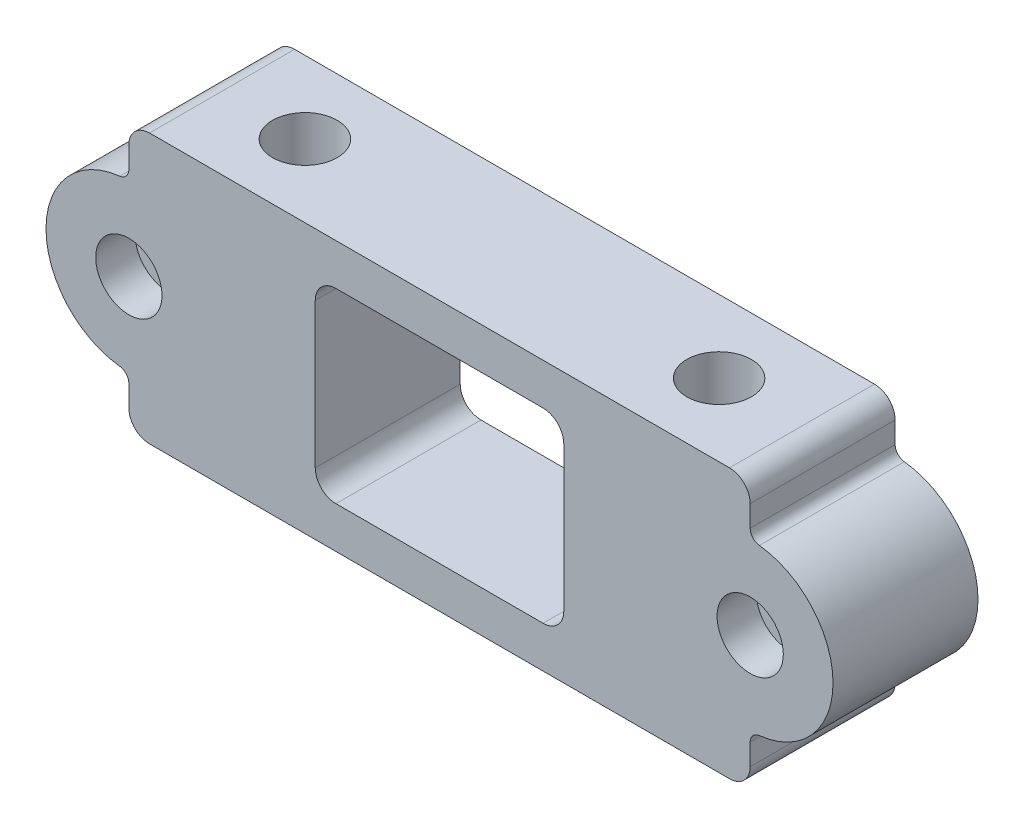
ISO-10303-21;
HEADER;
FILE_DESCRIPTION(('STEP AP214'),'2;1');
FILE_NAME('part.step','',(''),(''),'','','');
FILE_SCHEMA(('AUTOMOTIVE_DESIGN { 1 0 10303 214 1 1 1 1 }'));
ENDSEC;
DATA;
#1=APPLICATION_CONTEXT('core data for automotive mechanical design processes');
#2=APPLICATION_PROTOCOL_DEFINITION('international standard','automotive_design',2000,#1);
#3=PRODUCT_CONTEXT('',#1,'mechanical');
#4=PRODUCT('Part','Part','',(#3));
#5=PRODUCT_RELATED_PRODUCT_CATEGORY('part','',(#4));
#6=PRODUCT_DEFINITION_FORMATION('','',#4);
#7=PRODUCT_DEFINITION_CONTEXT('part definition',#1,'design');
#8=PRODUCT_DEFINITION('design','',#6,#7);
#9=PRODUCT_DEFINITION_SHAPE('','',#8);
#10=(LENGTH_UNIT() NAMED_UNIT(*) SI_UNIT(.MILLI.,.METRE.));
#11=(NAMED_UNIT(*) PLANE_ANGLE_UNIT() SI_UNIT($,.RADIAN.));
#12=(NAMED_UNIT(*) SI_UNIT($,.STERADIAN.) SOLID_ANGLE_UNIT());
#13=UNCERTAINTY_MEASURE_WITH_UNIT(LENGTH_MEASURE(1.E-05),#10,'distance_accuracy_value','');
#14=(GEOMETRIC_REPRESENTATION_CONTEXT(3) GLOBAL_UNCERTAINTY_ASSIGNED_CONTEXT((#13)) GLOBAL_UNIT_ASSIGNED_CONTEXT((#10,
#11,#12)) REPRESENTATION_CONTEXT('',''));
#15=CARTESIAN_POINT('',(0.,0.,0.));
#16=DIRECTION('',(0.,0.,1.));
#17=DIRECTION('',(1.,0.,0.));
#18=AXIS2_PLACEMENT_3D('',#15,#16,#17);
#19=CARTESIAN_POINT('',(101.6,-33.02,0.));
#20=DIRECTION('',(0.,0.,1.));
#21=DIRECTION('',(1.,0.,0.));
#22=AXIS2_PLACEMENT_3D('',#19,#20,#21);
#23=PLANE('',#22);
#24=CARTESIAN_POINT('',(38.1,-25.4,0.));
#25=DIRECTION('',(0.,0.,1.));
#26=DIRECTION('',(-1.,0.,0.));
#27=AXIS2_PLACEMENT_3D('',#24,#25,#26);
#28=CIRCLE('',#27,2.54);
#29=CARTESIAN_POINT('',(35.56,-25.4,0.));
#30=VERTEX_POINT('',#29);
#31=CARTESIAN_POINT('',(38.1,-27.94,0.));
#32=VERTEX_POINT('',#31);
#33=EDGE_CURVE('E58',#30,#32,#28,.T.);
#34=ORIENTED_EDGE('',*,*,#33,.F.);
#35=DIRECTION('',(0.,-1.,0.));
#36=VECTOR('',#35,1.);
#37=CARTESIAN_POINT('',(35.56,-25.4,0.));
#38=LINE('',#37,#36);
#39=CARTESIAN_POINT('',(35.56,-7.62,0.));
#40=VERTEX_POINT('',#39);
#41=EDGE_CURVE('E226',#40,#30,#38,.T.);
#42=ORIENTED_EDGE('',*,*,#41,.F.);
#43=CARTESIAN_POINT('',(38.1,-7.61999999999999,0.));
#44=DIRECTION('',(0.,0.,1.));
#45=DIRECTION('',(-1.,0.,0.));
#46=AXIS2_PLACEMENT_3D('',#43,#44,#45);
#47=CIRCLE('',#46,2.54);
#48=CARTESIAN_POINT('',(38.1,-5.07999999999999,0.));
#49=VERTEX_POINT('',#48);
#50=EDGE_CURVE('E230',#49,#40,#47,.T.);
#51=ORIENTED_EDGE('',*,*,#50,.F.);
#52=DIRECTION('',(-1.,0.,0.));
#53=VECTOR('',#52,1.);
#54=CARTESIAN_POINT('',(38.1,-5.07999999999999,0.));
#55=LINE('',#54,#53);
#56=CARTESIAN_POINT('',(63.5,-5.07999999999999,0.));
#57=VERTEX_POINT('',#56);
#58=EDGE_CURVE('E269',#57,#49,#55,.T.);
#59=ORIENTED_EDGE('',*,*,#58,.F.);
#60=CARTESIAN_POINT('',(63.5,-7.61999999999999,0.));
#61=DIRECTION('',(0.,0.,1.));
#62=DIRECTION('',(-1.,0.,0.));
#63=AXIS2_PLACEMENT_3D('',#60,#61,#62);
#64=CIRCLE('',#63,2.54);
#65=CARTESIAN_POINT('',(66.04,-7.62,0.));
#66=VERTEX_POINT('',#65);
#67=EDGE_CURVE('E265',#66,#57,#64,.T.);
#68=ORIENTED_EDGE('',*,*,#67,.F.);
#69=DIRECTION('',(0.,1.,0.));
#70=VECTOR('',#69,1.);
#71=CARTESIAN_POINT('',(66.04,-25.4,0.));
#72=LINE('',#71,#70);
#73=CARTESIAN_POINT('',(66.04,-25.4,0.));
#74=VERTEX_POINT('',#73);
#75=EDGE_CURVE('E261',#74,#66,#72,.T.);
#76=ORIENTED_EDGE('',*,*,#75,.F.);
#77=CARTESIAN_POINT('',(63.5,-25.4,0.));
#78=DIRECTION('',(0.,0.,1.));
#79=DIRECTION('',(1.,0.,0.));
#80=AXIS2_PLACEMENT_3D('',#77,#78,#79);
#81=CIRCLE('',#80,2.54);
#82=CARTESIAN_POINT('',(63.5,-27.94,0.));
#83=VERTEX_POINT('',#82);
#84=EDGE_CURVE('E257',#83,#74,#81,.T.);
#85=ORIENTED_EDGE('',*,*,#84,.F.);
#86=DIRECTION('',(1.,0.,0.));
#87=VECTOR('',#86,1.);
#88=CARTESIAN_POINT('',(38.1,-27.94,0.));
#89=LINE('',#88,#87);
#90=EDGE_CURVE('E254',#32,#83,#89,.T.);
#91=ORIENTED_EDGE('',*,*,#90,.F.);
#92=EDGE_LOOP('',(#34,#42,#51,#59,#68,#76,#85,#91));
#93=FACE_BOUND('',#92,.T.);
#94=CARTESIAN_POINT('',(88.9,-16.51,0.));
#95=DIRECTION('',(0.,0.,1.));
#96=DIRECTION('',(1.,0.,0.));
#97=AXIS2_PLACEMENT_3D('',#94,#95,#96);
#98=CIRCLE('',#97,4.064);
#99=CARTESIAN_POINT('',(92.964,-16.51,0.));
#100=VERTEX_POINT('',#99);
#101=EDGE_CURVE('E404',#100,#100,#98,.T.);
#102=ORIENTED_EDGE('',*,*,#101,.F.);
#103=EDGE_LOOP('',(#102));
#104=FACE_BOUND('',#103,.T.);
#105=CARTESIAN_POINT('',(12.7,-16.51,0.));
#106=DIRECTION('',(0.,0.,1.));
#107=DIRECTION('',(1.,0.,0.));
#108=AXIS2_PLACEMENT_3D('',#105,#106,#107);
#109=CIRCLE('',#108,4.064);
#110=CARTESIAN_POINT('',(16.764,-16.51,0.));
#111=VERTEX_POINT('',#110);
#112=EDGE_CURVE('E340',#111,#111,#109,.T.);
#113=ORIENTED_EDGE('',*,*,#112,.F.);
#114=EDGE_LOOP('',(#113));
#115=FACE_BOUND('',#114,.T.);
#116=DIRECTION('',(1.,0.,0.));
#117=VECTOR('',#116,1.);
#118=CARTESIAN_POINT('',(101.6,0.,0.));
#119=LINE('',#118,#117);
#120=CARTESIAN_POINT('',(15.24,0.,0.));
#121=VERTEX_POINT('',#120);
#122=CARTESIAN_POINT('',(86.36,0.,0.));
#123=VERTEX_POINT('',#122);
#124=EDGE_CURVE('E446',#121,#123,#119,.T.);
#125=ORIENTED_EDGE('',*,*,#124,.F.);
#126=CARTESIAN_POINT('',(15.24,-2.54,0.));
#127=DIRECTION('',(0.,0.,1.));
#128=DIRECTION('',(1.,0.,0.));
#129=AXIS2_PLACEMENT_3D('',#126,#127,#128);
#130=CIRCLE('',#129,2.54);
#131=CARTESIAN_POINT('',(12.7,-2.54,0.));
#132=VERTEX_POINT('',#131);
#133=EDGE_CURVE('E478',#121,#132,#130,.T.);
#134=ORIENTED_EDGE('',*,*,#133,.T.);
#135=DIRECTION('',(0.,1.,0.));
#136=VECTOR('',#135,1.);
#137=CARTESIAN_POINT('',(12.7,-5.15077467430091,0.));
#138=LINE('',#137,#136);
#139=CARTESIAN_POINT('',(12.7,-5.15077467430091,0.));
#140=VERTEX_POINT('',#139);
#141=EDGE_CURVE('E322',#140,#132,#138,.T.);
#142=ORIENTED_EDGE('',*,*,#141,.F.);
#143=CARTESIAN_POINT('',(11.43,-5.15077467430094,0.));
#144=DIRECTION('',(0.,0.,1.));
#145=DIRECTION('',(-1.,0.,0.));
#146=AXIS2_PLACEMENT_3D('',#143,#144,#145);
#147=CIRCLE('',#146,1.26999999999998);
#148=CARTESIAN_POINT('',(11.5711111111111,-6.41291082160079,0.));
#149=VERTEX_POINT('',#148);
#150=EDGE_CURVE('E318',#149,#140,#147,.T.);
#151=ORIENTED_EDGE('',*,*,#150,.F.);
#152=CARTESIAN_POINT('',(12.7,-16.5099999999999,0.));
#153=DIRECTION('',(0.,0.,-1.));
#154=DIRECTION('',(-1.,0.,0.));
#155=AXIS2_PLACEMENT_3D('',#152,#153,#154);
#156=CIRCLE('',#155,10.1600000000001);
#157=CARTESIAN_POINT('',(11.5711111111111,-26.607089178399,0.));
#158=VERTEX_POINT('',#157);
#159=EDGE_CURVE('E302',#158,#149,#156,.T.);
#160=ORIENTED_EDGE('',*,*,#159,.F.);
#161=CARTESIAN_POINT('',(11.43,-27.8692253256989,0.));
#162=DIRECTION('',(0.,0.,1.));
#163=DIRECTION('',(1.,0.,0.));
#164=AXIS2_PLACEMENT_3D('',#161,#162,#163);
#165=CIRCLE('',#164,1.27);
#166=CARTESIAN_POINT('',(12.7,-27.8692253256989,0.));
#167=VERTEX_POINT('',#166);
#168=EDGE_CURVE('E330',#167,#158,#165,.T.);
#169=ORIENTED_EDGE('',*,*,#168,.F.);
#170=DIRECTION('',(0.,1.,0.));
#171=VECTOR('',#170,1.);
#172=CARTESIAN_POINT('',(12.7,-27.8692253256989,0.));
#173=LINE('',#172,#171);
#174=CARTESIAN_POINT('',(12.7,-30.48,0.));
#175=VERTEX_POINT('',#174);
#176=EDGE_CURVE('E327',#175,#167,#173,.T.);
#177=ORIENTED_EDGE('',*,*,#176,.F.);
#178=CARTESIAN_POINT('',(15.24,-30.48,0.));
#179=DIRECTION('',(0.,0.,1.));
#180=DIRECTION('',(1.,0.,0.));
#181=AXIS2_PLACEMENT_3D('',#178,#179,#180);
#182=CIRCLE('',#181,2.54);
#183=CARTESIAN_POINT('',(15.24,-33.02,0.));
#184=VERTEX_POINT('',#183);
#185=EDGE_CURVE('E469',#175,#184,#182,.T.);
#186=ORIENTED_EDGE('',*,*,#185,.T.);
#187=DIRECTION('',(1.,0.,0.));
#188=VECTOR('',#187,1.);
#189=CARTESIAN_POINT('',(101.6,-33.02,0.));
#190=LINE('',#189,#188);
#191=CARTESIAN_POINT('',(86.36,-33.02,0.));
#192=VERTEX_POINT('',#191);
#193=EDGE_CURVE('E445',#184,#192,#190,.T.);
#194=ORIENTED_EDGE('',*,*,#193,.T.);
#195=CARTESIAN_POINT('',(86.36,-30.48,0.));
#196=DIRECTION('',(0.,0.,1.));
#197=DIRECTION('',(1.,0.,0.));
#198=AXIS2_PLACEMENT_3D('',#195,#196,#197);
#199=CIRCLE('',#198,2.54);
#200=CARTESIAN_POINT('',(88.9,-30.48,2.66050878019847E-13));
#201=VERTEX_POINT('',#200);
#202=EDGE_CURVE('E472',#192,#201,#199,.T.);
#203=ORIENTED_EDGE('',*,*,#202,.T.);
#204=DIRECTION('',(0.,-1.,0.));
#205=VECTOR('',#204,1.);
#206=CARTESIAN_POINT('',(88.9,-27.8692253256989,2.66050878019847E-13));
#207=LINE('',#206,#205);
#208=CARTESIAN_POINT('',(88.9,-27.8692253256989,2.66050878019847E-13));
#209=VERTEX_POINT('',#208);
#210=EDGE_CURVE('E382',#209,#201,#207,.T.);
#211=ORIENTED_EDGE('',*,*,#210,.F.);
#212=CARTESIAN_POINT('',(90.17,-27.8692253256989,2.74919240620508E-13));
#213=DIRECTION('',(0.,0.,1.));
#214=DIRECTION('',(-1.,0.,0.));
#215=AXIS2_PLACEMENT_3D('',#212,#213,#214);
#216=CIRCLE('',#215,1.27);
#217=CARTESIAN_POINT('',(90.0288888888889,-26.607089178399,2.73933866998212E-13));
#218=VERTEX_POINT('',#217);
#219=EDGE_CURVE('E378',#218,#209,#216,.T.);
#220=ORIENTED_EDGE('',*,*,#219,.F.);
#221=CARTESIAN_POINT('',(88.9,-16.5099999999999,2.66050878019847E-13));
#222=DIRECTION('',(0.,0.,-1.));
#223=DIRECTION('',(1.,0.,0.));
#224=AXIS2_PLACEMENT_3D('',#221,#222,#223);
#225=CIRCLE('',#224,10.1600000000001);
#226=CARTESIAN_POINT('',(90.0288888888889,-6.41291082160078,2.73933866998212E-13));
#227=VERTEX_POINT('',#226);
#228=EDGE_CURVE('E374',#227,#218,#225,.T.);
#229=ORIENTED_EDGE('',*,*,#228,.F.);
#230=CARTESIAN_POINT('',(90.17,-5.15077467430092,2.74919240620508E-13));
#231=DIRECTION('',(0.,0.,1.));
#232=DIRECTION('',(1.,0.,0.));
#233=AXIS2_PLACEMENT_3D('',#230,#231,#232);
#234=CIRCLE('',#233,1.26999999999998);
#235=CARTESIAN_POINT('',(88.9,-5.1507746743009,2.66050878019847E-13));
#236=VERTEX_POINT('',#235);
#237=EDGE_CURVE('E279',#236,#227,#234,.T.);
#238=ORIENTED_EDGE('',*,*,#237,.F.);
#239=DIRECTION('',(0.,-1.,0.));
#240=VECTOR('',#239,1.);
#241=CARTESIAN_POINT('',(88.9,-5.1507746743009,2.66050878019847E-13));
#242=LINE('',#241,#240);
#243=CARTESIAN_POINT('',(88.9,-2.54,2.66050878019847E-13));
#244=VERTEX_POINT('',#243);
#245=EDGE_CURVE('E355',#244,#236,#242,.T.);
#246=ORIENTED_EDGE('',*,*,#245,.F.);
#247=CARTESIAN_POINT('',(86.36,-2.54,0.));
#248=DIRECTION('',(0.,0.,1.));
#249=DIRECTION('',(1.,0.,0.));
#250=AXIS2_PLACEMENT_3D('',#247,#248,#249);
#251=CIRCLE('',#250,2.54);
#252=EDGE_CURVE('E475',#244,#123,#251,.T.);
#253=ORIENTED_EDGE('',*,*,#252,.T.);
#254=EDGE_LOOP('',(#125,#134,#142,#151,#160,#169,#177,#186,#194,#203,#211,#220,#229,#238,#246,#253));
#255=FACE_BOUND('',#254,.T.);
#256=ADVANCED_FACE('F42',(#93,#104,#115,#255),#23,.T.);
#257=CARTESIAN_POINT('',(101.6,-33.02,-17.78));
#258=DIRECTION('',(0.,0.,-1.));
#259=DIRECTION('',(-1.,0.,0.));
#260=AXIS2_PLACEMENT_3D('',#257,#258,#259);
#261=PLANE('',#260);
#262=CARTESIAN_POINT('',(38.1,-25.4,-17.78));
#263=DIRECTION('',(0.,0.,1.));
#264=DIRECTION('',(-1.,0.,0.));
#265=AXIS2_PLACEMENT_3D('',#262,#263,#264);
#266=CIRCLE('',#265,2.54);
#267=CARTESIAN_POINT('',(35.56,-25.4,-17.78));
#268=VERTEX_POINT('',#267);
#269=CARTESIAN_POINT('',(38.1,-27.94,-17.78));
#270=VERTEX_POINT('',#269);
#271=EDGE_CURVE('E206',#268,#270,#266,.T.);
#272=ORIENTED_EDGE('',*,*,#271,.T.);
#273=DIRECTION('',(1.,0.,0.));
#274=VECTOR('',#273,1.);
#275=CARTESIAN_POINT('',(38.1,-27.94,-17.78));
#276=LINE('',#275,#274);
#277=CARTESIAN_POINT('',(63.5,-27.94,-17.78));
#278=VERTEX_POINT('',#277);
#279=EDGE_CURVE('E216',#270,#278,#276,.T.);
#280=ORIENTED_EDGE('',*,*,#279,.T.);
#281=CARTESIAN_POINT('',(63.5,-25.4,-17.78));
#282=DIRECTION('',(0.,0.,1.));
#283=DIRECTION('',(1.,0.,0.));
#284=AXIS2_PLACEMENT_3D('',#281,#282,#283);
#285=CIRCLE('',#284,2.54);
#286=CARTESIAN_POINT('',(66.04,-25.4,-17.78));
#287=VERTEX_POINT('',#286);
#288=EDGE_CURVE('E66',#278,#287,#285,.T.);
#289=ORIENTED_EDGE('',*,*,#288,.T.);
#290=DIRECTION('',(0.,1.,0.));
#291=VECTOR('',#290,1.);
#292=CARTESIAN_POINT('',(66.04,-25.4,-17.78));
#293=LINE('',#292,#291);
#294=CARTESIAN_POINT('',(66.04,-7.62,-17.78));
#295=VERTEX_POINT('',#294);
#296=EDGE_CURVE('E235',#287,#295,#293,.T.);
#297=ORIENTED_EDGE('',*,*,#296,.T.);
#298=CARTESIAN_POINT('',(63.5,-7.61999999999999,-17.78));
#299=DIRECTION('',(0.,0.,1.));
#300=DIRECTION('',(-1.,0.,0.));
#301=AXIS2_PLACEMENT_3D('',#298,#299,#300);
#302=CIRCLE('',#301,2.54);
#303=CARTESIAN_POINT('',(63.5,-5.07999999999999,-17.78));
#304=VERTEX_POINT('',#303);
#305=EDGE_CURVE('E239',#295,#304,#302,.T.);
#306=ORIENTED_EDGE('',*,*,#305,.T.);
#307=DIRECTION('',(-1.,0.,0.));
#308=VECTOR('',#307,1.);
#309=CARTESIAN_POINT('',(38.1,-5.07999999999999,-17.78));
#310=LINE('',#309,#308);
#311=CARTESIAN_POINT('',(38.1,-5.07999999999999,-17.78));
#312=VERTEX_POINT('',#311);
#313=EDGE_CURVE('E243',#304,#312,#310,.T.);
#314=ORIENTED_EDGE('',*,*,#313,.T.);
#315=CARTESIAN_POINT('',(38.1,-7.61999999999999,-17.78));
#316=DIRECTION('',(0.,0.,1.));
#317=DIRECTION('',(-1.,0.,0.));
#318=AXIS2_PLACEMENT_3D('',#315,#316,#317);
#319=CIRCLE('',#318,2.54);
#320=CARTESIAN_POINT('',(35.56,-7.62,-17.78));
#321=VERTEX_POINT('',#320);
#322=EDGE_CURVE('E247',#312,#321,#319,.T.);
#323=ORIENTED_EDGE('',*,*,#322,.T.);
#324=DIRECTION('',(0.,-1.,0.));
#325=VECTOR('',#324,1.);
#326=CARTESIAN_POINT('',(35.56,-25.4,-17.78));
#327=LINE('',#326,#325);
#328=EDGE_CURVE('E213',#321,#268,#327,.T.);
#329=ORIENTED_EDGE('',*,*,#328,.T.);
#330=EDGE_LOOP('',(#272,#280,#289,#297,#306,#314,#323,#329));
#331=FACE_BOUND('',#330,.T.);
#332=CARTESIAN_POINT('',(88.9,-16.51,-17.78));
#333=DIRECTION('',(0.,0.,-1.));
#334=DIRECTION('',(-1.,0.,0.));
#335=AXIS2_PLACEMENT_3D('',#332,#333,#334);
#336=CIRCLE('',#335,2.4892);
#337=CARTESIAN_POINT('',(86.4108,-16.51,-17.78));
#338=VERTEX_POINT('',#337);
#339=EDGE_CURVE('E415',#338,#338,#336,.F.);
#340=ORIENTED_EDGE('',*,*,#339,.T.);
#341=EDGE_LOOP('',(#340));
#342=FACE_BOUND('',#341,.T.);
#343=CARTESIAN_POINT('',(12.7,-16.51,-17.78));
#344=DIRECTION('',(0.,0.,-1.));
#345=DIRECTION('',(-1.,0.,0.));
#346=AXIS2_PLACEMENT_3D('',#343,#344,#345);
#347=CIRCLE('',#346,2.4892);
#348=CARTESIAN_POINT('',(10.2108,-16.51,-17.78));
#349=VERTEX_POINT('',#348);
#350=EDGE_CURVE('E420',#349,#349,#347,.F.);
#351=ORIENTED_EDGE('',*,*,#350,.T.);
#352=EDGE_LOOP('',(#351));
#353=FACE_BOUND('',#352,.T.);
#354=DIRECTION('',(0.,1.,0.));
#355=VECTOR('',#354,1.);
#356=CARTESIAN_POINT('',(12.7,-5.15077467430091,-17.78));
#357=LINE('',#356,#355);
#358=CARTESIAN_POINT('',(12.7,-5.15077467430091,-17.78));
#359=VERTEX_POINT('',#358);
#360=CARTESIAN_POINT('',(12.7,-2.54,-17.78));
#361=VERTEX_POINT('',#360);
#362=EDGE_CURVE('E301',#359,#361,#357,.T.);
#363=ORIENTED_EDGE('',*,*,#362,.T.);
#364=CARTESIAN_POINT('',(15.24,-2.54,-17.78));
#365=DIRECTION('',(0.,0.,-1.));
#366=DIRECTION('',(-1.,0.,0.));
#367=AXIS2_PLACEMENT_3D('',#364,#365,#366);
#368=CIRCLE('',#367,2.54);
#369=CARTESIAN_POINT('',(15.24,0.,-17.78));
#370=VERTEX_POINT('',#369);
#371=EDGE_CURVE('E493',#361,#370,#368,.T.);
#372=ORIENTED_EDGE('',*,*,#371,.T.);
#373=DIRECTION('',(-1.,0.,0.));
#374=VECTOR('',#373,1.);
#375=CARTESIAN_POINT('',(101.6,0.,-17.78));
#376=LINE('',#375,#374);
#377=CARTESIAN_POINT('',(86.36,0.,-17.78));
#378=VERTEX_POINT('',#377);
#379=EDGE_CURVE('E437',#378,#370,#376,.T.);
#380=ORIENTED_EDGE('',*,*,#379,.F.);
#381=CARTESIAN_POINT('',(86.36,-2.54,-17.78));
#382=DIRECTION('',(0.,0.,-1.));
#383=DIRECTION('',(-1.,0.,0.));
#384=AXIS2_PLACEMENT_3D('',#381,#382,#383);
#385=CIRCLE('',#384,2.54);
#386=CARTESIAN_POINT('',(88.9,-2.54,-17.7799999999997));
#387=VERTEX_POINT('',#386);
#388=EDGE_CURVE('E490',#378,#387,#385,.T.);
#389=ORIENTED_EDGE('',*,*,#388,.T.);
#390=DIRECTION('',(0.,-1.,0.));
#391=VECTOR('',#390,1.);
#392=CARTESIAN_POINT('',(88.9,-5.1507746743009,-17.7799999999997));
#393=LINE('',#392,#391);
#394=CARTESIAN_POINT('',(88.9,-5.1507746743009,-17.7799999999997));
#395=VERTEX_POINT('',#394);
#396=EDGE_CURVE('E367',#387,#395,#393,.T.);
#397=ORIENTED_EDGE('',*,*,#396,.T.);
#398=CARTESIAN_POINT('',(90.17,-5.15077467430092,-17.7799999999997));
#399=DIRECTION('',(0.,0.,1.));
#400=DIRECTION('',(1.,0.,0.));
#401=AXIS2_PLACEMENT_3D('',#398,#399,#400);
#402=CIRCLE('',#401,1.26999999999998);
#403=CARTESIAN_POINT('',(90.0288888888889,-6.41291082160078,-17.7799999999997));
#404=VERTEX_POINT('',#403);
#405=EDGE_CURVE('E350',#395,#404,#402,.T.);
#406=ORIENTED_EDGE('',*,*,#405,.T.);
#407=CARTESIAN_POINT('',(88.9,-16.5099999999999,-17.7799999999997));
#408=DIRECTION('',(0.,0.,-1.));
#409=DIRECTION('',(1.,0.,0.));
#410=AXIS2_PLACEMENT_3D('',#407,#408,#409);
#411=CIRCLE('',#410,10.1600000000001);
#412=CARTESIAN_POINT('',(90.0288888888889,-26.607089178399,-17.7799999999997));
#413=VERTEX_POINT('',#412);
#414=EDGE_CURVE('E354',#404,#413,#411,.T.);
#415=ORIENTED_EDGE('',*,*,#414,.T.);
#416=CARTESIAN_POINT('',(90.17,-27.8692253256989,-17.7799999999997));
#417=DIRECTION('',(0.,0.,1.));
#418=DIRECTION('',(-1.,0.,0.));
#419=AXIS2_PLACEMENT_3D('',#416,#417,#418);
#420=CIRCLE('',#419,1.27);
#421=CARTESIAN_POINT('',(88.9,-27.8692253256989,-17.7799999999997));
#422=VERTEX_POINT('',#421);
#423=EDGE_CURVE('E359',#413,#422,#420,.T.);
#424=ORIENTED_EDGE('',*,*,#423,.T.);
#425=DIRECTION('',(0.,-1.,0.));
#426=VECTOR('',#425,1.);
#427=CARTESIAN_POINT('',(88.9,-27.8692253256989,-17.7799999999997));
#428=LINE('',#427,#426);
#429=CARTESIAN_POINT('',(88.9,-30.48,-17.7799999999997));
#430=VERTEX_POINT('',#429);
#431=EDGE_CURVE('E363',#422,#430,#428,.T.);
#432=ORIENTED_EDGE('',*,*,#431,.T.);
#433=CARTESIAN_POINT('',(86.36,-30.48,-17.78));
#434=DIRECTION('',(0.,0.,-1.));
#435=DIRECTION('',(-1.,0.,0.));
#436=AXIS2_PLACEMENT_3D('',#433,#434,#435);
#437=CIRCLE('',#436,2.54);
#438=CARTESIAN_POINT('',(86.36,-33.02,-17.78));
#439=VERTEX_POINT('',#438);
#440=EDGE_CURVE('E487',#430,#439,#437,.T.);
#441=ORIENTED_EDGE('',*,*,#440,.T.);
#442=DIRECTION('',(-1.,0.,0.));
#443=VECTOR('',#442,1.);
#444=CARTESIAN_POINT('',(101.6,-33.02,-17.78));
#445=LINE('',#444,#443);
#446=CARTESIAN_POINT('',(15.24,-33.02,-17.78));
#447=VERTEX_POINT('',#446);
#448=EDGE_CURVE('E441',#439,#447,#445,.T.);
#449=ORIENTED_EDGE('',*,*,#448,.T.);
#450=CARTESIAN_POINT('',(15.24,-30.48,-17.78));
#451=DIRECTION('',(0.,0.,-1.));
#452=DIRECTION('',(-1.,0.,0.));
#453=AXIS2_PLACEMENT_3D('',#450,#451,#452);
#454=CIRCLE('',#453,2.54);
#455=CARTESIAN_POINT('',(12.7,-30.48,-17.78));
#456=VERTEX_POINT('',#455);
#457=EDGE_CURVE('E484',#447,#456,#454,.T.);
#458=ORIENTED_EDGE('',*,*,#457,.T.);
#459=DIRECTION('',(0.,1.,0.));
#460=VECTOR('',#459,1.);
#461=CARTESIAN_POINT('',(12.7,-27.8692253256989,-17.78));
#462=LINE('',#461,#460);
#463=CARTESIAN_POINT('',(12.7,-27.8692253256989,-17.78));
#464=VERTEX_POINT('',#463);
#465=EDGE_CURVE('E306',#456,#464,#462,.T.);
#466=ORIENTED_EDGE('',*,*,#465,.T.);
#467=CARTESIAN_POINT('',(11.43,-27.8692253256989,-17.78));
#468=DIRECTION('',(0.,0.,1.));
#469=DIRECTION('',(1.,0.,0.));
#470=AXIS2_PLACEMENT_3D('',#467,#468,#469);
#471=CIRCLE('',#470,1.27);
#472=CARTESIAN_POINT('',(11.5711111111111,-26.607089178399,-17.78));
#473=VERTEX_POINT('',#472);
#474=EDGE_CURVE('E309',#464,#473,#471,.T.);
#475=ORIENTED_EDGE('',*,*,#474,.T.);
#476=CARTESIAN_POINT('',(12.7,-16.5099999999999,-17.78));
#477=DIRECTION('',(0.,0.,-1.));
#478=DIRECTION('',(-1.,0.,0.));
#479=AXIS2_PLACEMENT_3D('',#476,#477,#478);
#480=CIRCLE('',#479,10.1600000000001);
#481=CARTESIAN_POINT('',(11.5711111111111,-6.41291082160079,-17.78));
#482=VERTEX_POINT('',#481);
#483=EDGE_CURVE('E313',#473,#482,#480,.T.);
#484=ORIENTED_EDGE('',*,*,#483,.T.);
#485=CARTESIAN_POINT('',(11.43,-5.15077467430094,-17.78));
#486=DIRECTION('',(0.,0.,1.));
#487=DIRECTION('',(-1.,0.,0.));
#488=AXIS2_PLACEMENT_3D('',#485,#486,#487);
#489=CIRCLE('',#488,1.26999999999998);
#490=EDGE_CURVE('E297',#482,#359,#489,.T.);
#491=ORIENTED_EDGE('',*,*,#490,.T.);
#492=EDGE_LOOP('',(#363,#372,#380,#389,#397,#406,#415,#424,#432,#441,#449,#458,#466,#475,#484,#491));
#493=FACE_BOUND('',#492,.T.);
#494=ADVANCED_FACE('F221',(#331,#342,#353,#493),#261,.T.);
#495=CARTESIAN_POINT('',(12.7,-16.51,-24.8205207989182));
#496=DIRECTION('',(0.,0.,1.));
#497=DIRECTION('',(1.,0.,0.));
#498=AXIS2_PLACEMENT_3D('',#495,#496,#497);
#499=CYLINDRICAL_SURFACE('',#498,2.4892);
#500=ORIENTED_EDGE('',*,*,#350,.F.);
#501=EDGE_LOOP('',(#500));
#502=FACE_BOUND('',#501,.T.);
#503=CARTESIAN_POINT('',(12.7,-16.51,-4.826));
#504=DIRECTION('',(0.,0.,1.));
#505=DIRECTION('',(1.,0.,0.));
#506=AXIS2_PLACEMENT_3D('',#503,#504,#505);
#507=CIRCLE('',#506,2.4892);
#508=CARTESIAN_POINT('',(15.1892,-16.51,-4.826));
#509=VERTEX_POINT('',#508);
#510=EDGE_CURVE('E424',#509,#509,#507,.F.);
#511=ORIENTED_EDGE('',*,*,#510,.F.);
#512=EDGE_LOOP('',(#511));
#513=FACE_BOUND('',#512,.T.);
#514=ADVANCED_FACE('F593',(#502,#513),#499,.F.);
#515=CARTESIAN_POINT('',(88.9,-16.51,-24.8205207989182));
#516=DIRECTION('',(0.,0.,1.));
#517=DIRECTION('',(1.,0.,0.));
#518=AXIS2_PLACEMENT_3D('',#515,#516,#517);
#519=CYLINDRICAL_SURFACE('',#518,2.4892);
#520=ORIENTED_EDGE('',*,*,#339,.F.);
#521=EDGE_LOOP('',(#520));
#522=FACE_BOUND('',#521,.T.);
#523=CARTESIAN_POINT('',(88.9,-16.51,-4.826));
#524=DIRECTION('',(0.,0.,1.));
#525=DIRECTION('',(1.,0.,0.));
#526=AXIS2_PLACEMENT_3D('',#523,#524,#525);
#527=CIRCLE('',#526,2.4892);
#528=CARTESIAN_POINT('',(91.3892,-16.51,-4.826));
#529=VERTEX_POINT('',#528);
#530=EDGE_CURVE('E403',#529,#529,#527,.F.);
#531=ORIENTED_EDGE('',*,*,#530,.F.);
#532=EDGE_LOOP('',(#531));
#533=FACE_BOUND('',#532,.T.);
#534=ADVANCED_FACE('F655',(#522,#533),#519,.F.);
#535=CARTESIAN_POINT('',(0.,-33.02,0.));
#536=DIRECTION('',(0.,-1.,0.));
#537=DIRECTION('',(0.,0.,-1.));
#538=AXIS2_PLACEMENT_3D('',#535,#536,#537);
#539=PLANE('',#538);
#540=ORIENTED_EDGE('',*,*,#448,.F.);
#541=DIRECTION('',(0.,0.,1.));
#542=VECTOR('',#541,1.);
#543=CARTESIAN_POINT('',(86.36,-33.02,2.66050878019847E-13));
#544=LINE('',#543,#542);
#545=EDGE_CURVE('E503',#439,#192,#544,.T.);
#546=ORIENTED_EDGE('',*,*,#545,.T.);
#547=ORIENTED_EDGE('',*,*,#193,.F.);
#548=DIRECTION('',(0.,0.,1.));
#549=VECTOR('',#548,1.);
#550=CARTESIAN_POINT('',(15.24,-33.02,-17.78));
#551=LINE('',#550,#549);
#552=EDGE_CURVE('E500',#184,#447,#551,.F.);
#553=ORIENTED_EDGE('',*,*,#552,.T.);
#554=EDGE_LOOP('',(#540,#546,#547,#553));
#555=FACE_BOUND('',#554,.T.);
#556=CARTESIAN_POINT('',(25.4,-33.02,-8.88999999999997));
#557=DIRECTION('',(0.,1.,0.));
#558=DIRECTION('',(0.,0.,1.));
#559=AXIS2_PLACEMENT_3D('',#556,#557,#558);
#560=CIRCLE('',#559,3.96874999999999);
#561=CARTESIAN_POINT('',(25.4,-33.02,-4.92124999999998));
#562=VERTEX_POINT('',#561);
#563=EDGE_CURVE('E425',#562,#562,#560,.T.);
#564=ORIENTED_EDGE('',*,*,#563,.T.);
#565=EDGE_LOOP('',(#564));
#566=FACE_BOUND('',#565,.T.);
#567=CARTESIAN_POINT('',(76.2,-33.02,-8.88999999999997));
#568=DIRECTION('',(0.,1.,0.));
#569=DIRECTION('',(0.,0.,1.));
#570=AXIS2_PLACEMENT_3D('',#567,#568,#569);
#571=CIRCLE('',#570,3.96875);
#572=CARTESIAN_POINT('',(76.2,-33.02,-4.92124999999997));
#573=VERTEX_POINT('',#572);
#574=EDGE_CURVE('E433',#573,#573,#571,.T.);
#575=ORIENTED_EDGE('',*,*,#574,.T.);
#576=EDGE_LOOP('',(#575));
#577=FACE_BOUND('',#576,.T.);
#578=ADVANCED_FACE('F521',(#555,#566,#577),#539,.T.);
#579=CARTESIAN_POINT('',(0.,0.,0.));
#580=DIRECTION('',(0.,-1.,0.));
#581=DIRECTION('',(0.,0.,-1.));
#582=AXIS2_PLACEMENT_3D('',#579,#580,#581);
#583=PLANE('',#582);
#584=CARTESIAN_POINT('',(25.4,0.,-8.88999999999997));
#585=DIRECTION('',(0.,1.,0.));
#586=DIRECTION('',(0.,0.,1.));
#587=AXIS2_PLACEMENT_3D('',#584,#585,#586);
#588=CIRCLE('',#587,3.96874999999999);
#589=CARTESIAN_POINT('',(25.4,0.,-4.92124999999998));
#590=VERTEX_POINT('',#589);
#591=EDGE_CURVE('E419',#590,#590,#588,.T.);
#592=ORIENTED_EDGE('',*,*,#591,.F.);
#593=EDGE_LOOP('',(#592));
#594=FACE_BOUND('',#593,.T.);
#595=CARTESIAN_POINT('',(76.2,0.,-8.88999999999997));
#596=DIRECTION('',(0.,1.,0.));
#597=DIRECTION('',(0.,0.,1.));
#598=AXIS2_PLACEMENT_3D('',#595,#596,#597);
#599=CIRCLE('',#598,3.96875);
#600=CARTESIAN_POINT('',(76.2,0.,-4.92124999999997));
#601=VERTEX_POINT('',#600);
#602=EDGE_CURVE('E429',#601,#601,#599,.T.);
#603=ORIENTED_EDGE('',*,*,#602,.F.);
#604=EDGE_LOOP('',(#603));
#605=FACE_BOUND('',#604,.T.);
#606=ORIENTED_EDGE('',*,*,#379,.T.);
#607=DIRECTION('',(0.,0.,1.));
#608=VECTOR('',#607,1.);
#609=CARTESIAN_POINT('',(15.24,0.,0.));
#610=LINE('',#609,#608);
#611=EDGE_CURVE('E465',#370,#121,#610,.T.);
#612=ORIENTED_EDGE('',*,*,#611,.T.);
#613=ORIENTED_EDGE('',*,*,#124,.T.);
#614=DIRECTION('',(0.,0.,1.));
#615=VECTOR('',#614,1.);
#616=CARTESIAN_POINT('',(86.36,0.,0.));
#617=LINE('',#616,#615);
#618=EDGE_CURVE('E450',#123,#378,#617,.F.);
#619=ORIENTED_EDGE('',*,*,#618,.T.);
#620=EDGE_LOOP('',(#606,#612,#613,#619));
#621=FACE_BOUND('',#620,.T.);
#622=ADVANCED_FACE('F555',(#594,#605,#621),#583,.F.);
#623=CARTESIAN_POINT('',(76.2,-33.02,-8.88999999999997));
#624=DIRECTION('',(0.,1.,0.));
#625=DIRECTION('',(0.,0.,1.));
#626=AXIS2_PLACEMENT_3D('',#623,#624,#625);
#627=CYLINDRICAL_SURFACE('',#626,3.96875);
#628=ORIENTED_EDGE('',*,*,#574,.F.);
#629=EDGE_LOOP('',(#628));
#630=FACE_BOUND('',#629,.T.);
#631=ORIENTED_EDGE('',*,*,#602,.T.);
#632=EDGE_LOOP('',(#631));
#633=FACE_BOUND('',#632,.T.);
#634=ADVANCED_FACE('F664',(#630,#633),#627,.F.);
#635=CARTESIAN_POINT('',(25.4,-33.02,-8.88999999999997));
#636=DIRECTION('',(0.,1.,0.));
#637=DIRECTION('',(0.,0.,1.));
#638=AXIS2_PLACEMENT_3D('',#635,#636,#637);
#639=CYLINDRICAL_SURFACE('',#638,3.96874999999999);
#640=ORIENTED_EDGE('',*,*,#563,.F.);
#641=EDGE_LOOP('',(#640));
#642=FACE_BOUND('',#641,.T.);
#643=ORIENTED_EDGE('',*,*,#591,.T.);
#644=EDGE_LOOP('',(#643));
#645=FACE_BOUND('',#644,.T.);
#646=ADVANCED_FACE('F647',(#642,#645),#639,.F.);
#647=CARTESIAN_POINT('',(88.9,-16.51,-4.826));
#648=DIRECTION('',(0.,0.,1.));
#649=DIRECTION('',(1.,0.,0.));
#650=AXIS2_PLACEMENT_3D('',#647,#648,#649);
#651=PLANE('',#650);
#652=CARTESIAN_POINT('',(88.9,-16.51,-4.826));
#653=DIRECTION('',(0.,0.,1.));
#654=DIRECTION('',(1.,0.,0.));
#655=AXIS2_PLACEMENT_3D('',#652,#653,#654);
#656=CIRCLE('',#655,4.064);
#657=CARTESIAN_POINT('',(92.964,-16.51,-4.826));
#658=VERTEX_POINT('',#657);
#659=EDGE_CURVE('E399',#658,#658,#656,.T.);
#660=ORIENTED_EDGE('',*,*,#659,.T.);
#661=EDGE_LOOP('',(#660));
#662=FACE_BOUND('',#661,.T.);
#663=ORIENTED_EDGE('',*,*,#530,.T.);
#664=EDGE_LOOP('',(#663));
#665=FACE_BOUND('',#664,.T.);
#666=ADVANCED_FACE('F643',(#662,#665),#651,.T.);
#667=CARTESIAN_POINT('',(88.9,-16.51,-4.826));
#668=DIRECTION('',(0.,0.,1.));
#669=DIRECTION('',(1.,0.,0.));
#670=AXIS2_PLACEMENT_3D('',#667,#668,#669);
#671=CYLINDRICAL_SURFACE('',#670,4.064);
#672=ORIENTED_EDGE('',*,*,#659,.F.);
#673=EDGE_LOOP('',(#672));
#674=FACE_BOUND('',#673,.T.);
#675=ORIENTED_EDGE('',*,*,#101,.T.);
#676=EDGE_LOOP('',(#675));
#677=FACE_BOUND('',#676,.T.);
#678=ADVANCED_FACE('F646',(#674,#677),#671,.F.);
#679=CARTESIAN_POINT('',(12.7,-16.51,-4.826));
#680=DIRECTION('',(0.,0.,1.));
#681=DIRECTION('',(1.,0.,0.));
#682=AXIS2_PLACEMENT_3D('',#679,#680,#681);
#683=PLANE('',#682);
#684=CARTESIAN_POINT('',(12.7,-16.51,-4.826));
#685=DIRECTION('',(0.,0.,1.));
#686=DIRECTION('',(1.,0.,0.));
#687=AXIS2_PLACEMENT_3D('',#684,#685,#686);
#688=CIRCLE('',#687,4.064);
#689=CARTESIAN_POINT('',(16.764,-16.51,-4.826));
#690=VERTEX_POINT('',#689);
#691=EDGE_CURVE('E408',#690,#690,#688,.T.);
#692=ORIENTED_EDGE('',*,*,#691,.T.);
#693=EDGE_LOOP('',(#692));
#694=FACE_BOUND('',#693,.T.);
#695=ORIENTED_EDGE('',*,*,#510,.T.);
#696=EDGE_LOOP('',(#695));
#697=FACE_BOUND('',#696,.T.);
#698=ADVANCED_FACE('F639',(#694,#697),#683,.T.);
#699=CARTESIAN_POINT('',(12.7,-16.51,-4.826));
#700=DIRECTION('',(0.,0.,1.));
#701=DIRECTION('',(1.,0.,0.));
#702=AXIS2_PLACEMENT_3D('',#699,#700,#701);
#703=CYLINDRICAL_SURFACE('',#702,4.064);
#704=ORIENTED_EDGE('',*,*,#691,.F.);
#705=EDGE_LOOP('',(#704));
#706=FACE_BOUND('',#705,.T.);
#707=ORIENTED_EDGE('',*,*,#112,.T.);
#708=EDGE_LOOP('',(#707));
#709=FACE_BOUND('',#708,.T.);
#710=ADVANCED_FACE('F634',(#706,#709),#703,.F.);
#711=CARTESIAN_POINT('',(90.17,-5.15077467430092,-17.7799999999997));
#712=DIRECTION('',(0.,0.,1.));
#713=DIRECTION('',(1.,0.,0.));
#714=AXIS2_PLACEMENT_3D('',#711,#712,#713);
#715=CYLINDRICAL_SURFACE('',#714,1.26999999999998);
#716=ORIENTED_EDGE('',*,*,#237,.T.);
#717=DIRECTION('',(0.,0.,1.));
#718=VECTOR('',#717,1.);
#719=CARTESIAN_POINT('',(90.0288888888889,-6.41291082160078,-17.7799999999997));
#720=LINE('',#719,#718);
#721=EDGE_CURVE('E370',#404,#227,#720,.T.);
#722=ORIENTED_EDGE('',*,*,#721,.F.);
#723=ORIENTED_EDGE('',*,*,#405,.F.);
#724=DIRECTION('',(0.,0.,1.));
#725=VECTOR('',#724,1.);
#726=CARTESIAN_POINT('',(88.9,-5.1507746743009,-17.7799999999997));
#727=LINE('',#726,#725);
#728=EDGE_CURVE('E323',#395,#236,#727,.T.);
#729=ORIENTED_EDGE('',*,*,#728,.T.);
#730=EDGE_LOOP('',(#716,#722,#723,#729));
#731=FACE_BOUND('',#730,.T.);
#732=ADVANCED_FACE('F571',(#731),#715,.F.);
#733=CARTESIAN_POINT('',(88.9,-5.1507746743009,-17.7799999999997));
#734=DIRECTION('',(-1.,0.,0.));
#735=DIRECTION('',(0.,0.,1.));
#736=AXIS2_PLACEMENT_3D('',#733,#734,#735);
#737=PLANE('',#736);
#738=ORIENTED_EDGE('',*,*,#396,.F.);
#739=DIRECTION('',(0.,0.,1.));
#740=VECTOR('',#739,1.);
#741=CARTESIAN_POINT('',(88.9,-2.54,-17.7799999999997));
#742=LINE('',#741,#740);
#743=EDGE_CURVE('E496',#387,#244,#742,.T.);
#744=ORIENTED_EDGE('',*,*,#743,.T.);
#745=ORIENTED_EDGE('',*,*,#245,.T.);
#746=ORIENTED_EDGE('',*,*,#728,.F.);
#747=EDGE_LOOP('',(#738,#744,#745,#746));
#748=FACE_BOUND('',#747,.T.);
#749=ADVANCED_FACE('F566',(#748),#737,.F.);
#750=CARTESIAN_POINT('',(88.9,-27.8692253256989,-17.7799999999997));
#751=DIRECTION('',(-1.,0.,0.));
#752=DIRECTION('',(0.,0.,1.));
#753=AXIS2_PLACEMENT_3D('',#750,#751,#752);
#754=PLANE('',#753);
#755=ORIENTED_EDGE('',*,*,#210,.T.);
#756=DIRECTION('',(0.,0.,1.));
#757=VECTOR('',#756,1.);
#758=CARTESIAN_POINT('',(88.9,-30.48,-17.7799999999997));
#759=LINE('',#758,#757);
#760=EDGE_CURVE('E51',#201,#430,#759,.F.);
#761=ORIENTED_EDGE('',*,*,#760,.T.);
#762=ORIENTED_EDGE('',*,*,#431,.F.);
#763=DIRECTION('',(0.,0.,1.));
#764=VECTOR('',#763,1.);
#765=CARTESIAN_POINT('',(88.9,-27.8692253256989,-17.7799999999997));
#766=LINE('',#765,#764);
#767=EDGE_CURVE('E391',#422,#209,#766,.T.);
#768=ORIENTED_EDGE('',*,*,#767,.T.);
#769=EDGE_LOOP('',(#755,#761,#762,#768));
#770=FACE_BOUND('',#769,.T.);
#771=ADVANCED_FACE('F510',(#770),#754,.F.);
#772=CARTESIAN_POINT('',(90.17,-27.8692253256989,-17.7799999999997));
#773=DIRECTION('',(0.,0.,1.));
#774=DIRECTION('',(1.,0.,0.));
#775=AXIS2_PLACEMENT_3D('',#772,#773,#774);
#776=CYLINDRICAL_SURFACE('',#775,1.27);
#777=ORIENTED_EDGE('',*,*,#219,.T.);
#778=ORIENTED_EDGE('',*,*,#767,.F.);
#779=ORIENTED_EDGE('',*,*,#423,.F.);
#780=DIRECTION('',(0.,0.,1.));
#781=VECTOR('',#780,1.);
#782=CARTESIAN_POINT('',(90.0288888888889,-26.607089178399,-17.7799999999997));
#783=LINE('',#782,#781);
#784=EDGE_CURVE('E394',#413,#218,#783,.T.);
#785=ORIENTED_EDGE('',*,*,#784,.T.);
#786=EDGE_LOOP('',(#777,#778,#779,#785));
#787=FACE_BOUND('',#786,.T.);
#788=ADVANCED_FACE('F577',(#787),#776,.F.);
#789=CARTESIAN_POINT('',(88.9,-16.5099999999999,-17.7799999999997));
#790=DIRECTION('',(0.,0.,1.));
#791=DIRECTION('',(1.,0.,0.));
#792=AXIS2_PLACEMENT_3D('',#789,#790,#791);
#793=CYLINDRICAL_SURFACE('',#792,10.1600000000001);
#794=ORIENTED_EDGE('',*,*,#228,.T.);
#795=ORIENTED_EDGE('',*,*,#784,.F.);
#796=ORIENTED_EDGE('',*,*,#414,.F.);
#797=ORIENTED_EDGE('',*,*,#721,.T.);
#798=EDGE_LOOP('',(#794,#795,#796,#797));
#799=FACE_BOUND('',#798,.T.);
#800=ADVANCED_FACE('F574',(#799),#793,.T.);
#801=CARTESIAN_POINT('',(11.43,-5.15077467430094,-17.78));
#802=DIRECTION('',(0.,0.,1.));
#803=DIRECTION('',(1.,0.,0.));
#804=AXIS2_PLACEMENT_3D('',#801,#802,#803);
#805=CYLINDRICAL_SURFACE('',#804,1.26999999999998);
#806=ORIENTED_EDGE('',*,*,#150,.T.);
#807=DIRECTION('',(0.,0.,1.));
#808=VECTOR('',#807,1.);
#809=CARTESIAN_POINT('',(12.7,-5.15077467430091,-17.78));
#810=LINE('',#809,#808);
#811=EDGE_CURVE('E317',#359,#140,#810,.T.);
#812=ORIENTED_EDGE('',*,*,#811,.F.);
#813=ORIENTED_EDGE('',*,*,#490,.F.);
#814=DIRECTION('',(0.,0.,1.));
#815=VECTOR('',#814,1.);
#816=CARTESIAN_POINT('',(11.5711111111111,-6.41291082160079,-17.78));
#817=LINE('',#816,#815);
#818=EDGE_CURVE('E337',#482,#149,#817,.T.);
#819=ORIENTED_EDGE('',*,*,#818,.T.);
#820=EDGE_LOOP('',(#806,#812,#813,#819));
#821=FACE_BOUND('',#820,.T.);
#822=ADVANCED_FACE('F545',(#821),#805,.F.);
#823=CARTESIAN_POINT('',(12.7,-16.5099999999999,-17.78));
#824=DIRECTION('',(0.,0.,1.));
#825=DIRECTION('',(1.,0.,0.));
#826=AXIS2_PLACEMENT_3D('',#823,#824,#825);
#827=CYLINDRICAL_SURFACE('',#826,10.1600000000001);
#828=ORIENTED_EDGE('',*,*,#159,.T.);
#829=ORIENTED_EDGE('',*,*,#818,.F.);
#830=ORIENTED_EDGE('',*,*,#483,.F.);
#831=DIRECTION('',(0.,0.,1.));
#832=VECTOR('',#831,1.);
#833=CARTESIAN_POINT('',(11.5711111111111,-26.607089178399,-17.78));
#834=LINE('',#833,#832);
#835=EDGE_CURVE('E341',#473,#158,#834,.T.);
#836=ORIENTED_EDGE('',*,*,#835,.T.);
#837=EDGE_LOOP('',(#828,#829,#830,#836));
#838=FACE_BOUND('',#837,.T.);
#839=ADVANCED_FACE('F541',(#838),#827,.T.);
#840=CARTESIAN_POINT('',(11.43,-27.8692253256989,-17.78));
#841=DIRECTION('',(0.,0.,1.));
#842=DIRECTION('',(1.,0.,0.));
#843=AXIS2_PLACEMENT_3D('',#840,#841,#842);
#844=CYLINDRICAL_SURFACE('',#843,1.27);
#845=ORIENTED_EDGE('',*,*,#168,.T.);
#846=ORIENTED_EDGE('',*,*,#835,.F.);
#847=ORIENTED_EDGE('',*,*,#474,.F.);
#848=DIRECTION('',(0.,0.,1.));
#849=VECTOR('',#848,1.);
#850=CARTESIAN_POINT('',(12.7,-27.8692253256989,-17.78));
#851=LINE('',#850,#849);
#852=EDGE_CURVE('E344',#464,#167,#851,.T.);
#853=ORIENTED_EDGE('',*,*,#852,.T.);
#854=EDGE_LOOP('',(#845,#846,#847,#853));
#855=FACE_BOUND('',#854,.T.);
#856=ADVANCED_FACE('F538',(#855),#844,.F.);
#857=CARTESIAN_POINT('',(12.7,-27.8692253256989,-17.78));
#858=DIRECTION('',(1.,0.,0.));
#859=DIRECTION('',(0.,0.,-1.));
#860=AXIS2_PLACEMENT_3D('',#857,#858,#859);
#861=PLANE('',#860);
#862=ORIENTED_EDGE('',*,*,#465,.F.);
#863=DIRECTION('',(0.,0.,1.));
#864=VECTOR('',#863,1.);
#865=CARTESIAN_POINT('',(12.7,-30.48,0.));
#866=LINE('',#865,#864);
#867=EDGE_CURVE('E11',#456,#175,#866,.T.);
#868=ORIENTED_EDGE('',*,*,#867,.T.);
#869=ORIENTED_EDGE('',*,*,#176,.T.);
#870=ORIENTED_EDGE('',*,*,#852,.F.);
#871=EDGE_LOOP('',(#862,#868,#869,#870));
#872=FACE_BOUND('',#871,.T.);
#873=ADVANCED_FACE('F533',(#872),#861,.F.);
#874=CARTESIAN_POINT('',(12.7,-5.15077467430091,-17.78));
#875=DIRECTION('',(1.,0.,0.));
#876=DIRECTION('',(0.,0.,-1.));
#877=AXIS2_PLACEMENT_3D('',#874,#875,#876);
#878=PLANE('',#877);
#879=ORIENTED_EDGE('',*,*,#141,.T.);
#880=DIRECTION('',(0.,0.,1.));
#881=VECTOR('',#880,1.);
#882=CARTESIAN_POINT('',(12.7,-2.54,-17.78));
#883=LINE('',#882,#881);
#884=EDGE_CURVE('E481',#132,#361,#883,.F.);
#885=ORIENTED_EDGE('',*,*,#884,.T.);
#886=ORIENTED_EDGE('',*,*,#362,.F.);
#887=ORIENTED_EDGE('',*,*,#811,.T.);
#888=EDGE_LOOP('',(#879,#885,#886,#887));
#889=FACE_BOUND('',#888,.T.);
#890=ADVANCED_FACE('F601',(#889),#878,.F.);
#891=CARTESIAN_POINT('',(15.24,-2.54,0.));
#892=DIRECTION('',(0.,0.,1.));
#893=DIRECTION('',(1.,0.,0.));
#894=AXIS2_PLACEMENT_3D('',#891,#892,#893);
#895=CYLINDRICAL_SURFACE('',#894,2.54);
#896=ORIENTED_EDGE('',*,*,#371,.F.);
#897=ORIENTED_EDGE('',*,*,#884,.F.);
#898=ORIENTED_EDGE('',*,*,#133,.F.);
#899=ORIENTED_EDGE('',*,*,#611,.F.);
#900=EDGE_LOOP('',(#896,#897,#898,#899));
#901=FACE_BOUND('',#900,.T.);
#902=ADVANCED_FACE('F553',(#901),#895,.T.);
#903=CARTESIAN_POINT('',(86.36,-2.54,-17.7799999999997));
#904=DIRECTION('',(0.,0.,1.));
#905=DIRECTION('',(1.,0.,0.));
#906=AXIS2_PLACEMENT_3D('',#903,#904,#905);
#907=CYLINDRICAL_SURFACE('',#906,2.54);
#908=ORIENTED_EDGE('',*,*,#388,.F.);
#909=ORIENTED_EDGE('',*,*,#618,.F.);
#910=ORIENTED_EDGE('',*,*,#252,.F.);
#911=ORIENTED_EDGE('',*,*,#743,.F.);
#912=EDGE_LOOP('',(#908,#909,#910,#911));
#913=FACE_BOUND('',#912,.T.);
#914=ADVANCED_FACE('F563',(#913),#907,.T.);
#915=CARTESIAN_POINT('',(86.36,-30.48,0.));
#916=DIRECTION('',(0.,0.,-1.));
#917=DIRECTION('',(-1.,0.,0.));
#918=AXIS2_PLACEMENT_3D('',#915,#916,#917);
#919=CYLINDRICAL_SURFACE('',#918,2.54);
#920=ORIENTED_EDGE('',*,*,#440,.F.);
#921=ORIENTED_EDGE('',*,*,#760,.F.);
#922=ORIENTED_EDGE('',*,*,#202,.F.);
#923=ORIENTED_EDGE('',*,*,#545,.F.);
#924=EDGE_LOOP('',(#920,#921,#922,#923));
#925=FACE_BOUND('',#924,.T.);
#926=ADVANCED_FACE('F518',(#925),#919,.T.);
#927=CARTESIAN_POINT('',(15.24,-30.48,-17.78));
#928=DIRECTION('',(0.,0.,-1.));
#929=DIRECTION('',(-1.,0.,0.));
#930=AXIS2_PLACEMENT_3D('',#927,#928,#929);
#931=CYLINDRICAL_SURFACE('',#930,2.54);
#932=ORIENTED_EDGE('',*,*,#457,.F.);
#933=ORIENTED_EDGE('',*,*,#552,.F.);
#934=ORIENTED_EDGE('',*,*,#185,.F.);
#935=ORIENTED_EDGE('',*,*,#867,.F.);
#936=EDGE_LOOP('',(#932,#933,#934,#935));
#937=FACE_BOUND('',#936,.T.);
#938=ADVANCED_FACE('F44',(#937),#931,.T.);
#939=CARTESIAN_POINT('',(38.1,-25.4,-17.78));
#940=DIRECTION('',(0.,0.,1.));
#941=DIRECTION('',(1.,0.,0.));
#942=AXIS2_PLACEMENT_3D('',#939,#940,#941);
#943=CYLINDRICAL_SURFACE('',#942,2.54);
#944=ORIENTED_EDGE('',*,*,#33,.T.);
#945=DIRECTION('',(0.,0.,1.));
#946=VECTOR('',#945,1.);
#947=CARTESIAN_POINT('',(38.1,-27.94,-17.78));
#948=LINE('',#947,#946);
#949=EDGE_CURVE('E202',#270,#32,#948,.T.);
#950=ORIENTED_EDGE('',*,*,#949,.F.);
#951=ORIENTED_EDGE('',*,*,#271,.F.);
#952=DIRECTION('',(0.,0.,1.));
#953=VECTOR('',#952,1.);
#954=CARTESIAN_POINT('',(35.56,-25.4,-17.78));
#955=LINE('',#954,#953);
#956=EDGE_CURVE('E276',#268,#30,#955,.T.);
#957=ORIENTED_EDGE('',*,*,#956,.T.);
#958=EDGE_LOOP('',(#944,#950,#951,#957));
#959=FACE_BOUND('',#958,.T.);
#960=ADVANCED_FACE('F204',(#959),#943,.F.);
#961=CARTESIAN_POINT('',(35.56,-25.4,-17.78));
#962=DIRECTION('',(-1.,0.,0.));
#963=DIRECTION('',(0.,0.,1.));
#964=AXIS2_PLACEMENT_3D('',#961,#962,#963);
#965=PLANE('',#964);
#966=ORIENTED_EDGE('',*,*,#41,.T.);
#967=ORIENTED_EDGE('',*,*,#956,.F.);
#968=ORIENTED_EDGE('',*,*,#328,.F.);
#969=DIRECTION('',(0.,0.,1.));
#970=VECTOR('',#969,1.);
#971=CARTESIAN_POINT('',(35.56,-7.62,-17.78));
#972=LINE('',#971,#970);
#973=EDGE_CURVE('E280',#321,#40,#972,.T.);
#974=ORIENTED_EDGE('',*,*,#973,.T.);
#975=EDGE_LOOP('',(#966,#967,#968,#974));
#976=FACE_BOUND('',#975,.T.);
#977=ADVANCED_FACE('F609',(#976),#965,.F.);
#978=CARTESIAN_POINT('',(38.1,-7.61999999999999,-17.78));
#979=DIRECTION('',(0.,0.,1.));
#980=DIRECTION('',(1.,0.,0.));
#981=AXIS2_PLACEMENT_3D('',#978,#979,#980);
#982=CYLINDRICAL_SURFACE('',#981,2.54);
#983=ORIENTED_EDGE('',*,*,#50,.T.);
#984=ORIENTED_EDGE('',*,*,#973,.F.);
#985=ORIENTED_EDGE('',*,*,#322,.F.);
#986=DIRECTION('',(0.,0.,1.));
#987=VECTOR('',#986,1.);
#988=CARTESIAN_POINT('',(38.1,-5.07999999999999,-17.78));
#989=LINE('',#988,#987);
#990=EDGE_CURVE('E283',#312,#49,#989,.T.);
#991=ORIENTED_EDGE('',*,*,#990,.T.);
#992=EDGE_LOOP('',(#983,#984,#985,#991));
#993=FACE_BOUND('',#992,.T.);
#994=ADVANCED_FACE('F614',(#993),#982,.F.);
#995=CARTESIAN_POINT('',(38.1,-5.07999999999999,-17.78));
#996=DIRECTION('',(0.,1.,0.));
#997=DIRECTION('',(0.,0.,1.));
#998=AXIS2_PLACEMENT_3D('',#995,#996,#997);
#999=PLANE('',#998);
#1000=ORIENTED_EDGE('',*,*,#58,.T.);
#1001=ORIENTED_EDGE('',*,*,#990,.F.);
#1002=ORIENTED_EDGE('',*,*,#313,.F.);
#1003=DIRECTION('',(0.,0.,1.));
#1004=VECTOR('',#1003,1.);
#1005=CARTESIAN_POINT('',(63.5,-5.07999999999999,-17.78));
#1006=LINE('',#1005,#1004);
#1007=EDGE_CURVE('E286',#304,#57,#1006,.T.);
#1008=ORIENTED_EDGE('',*,*,#1007,.T.);
#1009=EDGE_LOOP('',(#1000,#1001,#1002,#1008));
#1010=FACE_BOUND('',#1009,.T.);
#1011=ADVANCED_FACE('F810',(#1010),#999,.F.);
#1012=CARTESIAN_POINT('',(63.5,-7.61999999999999,-17.78));
#1013=DIRECTION('',(0.,0.,1.));
#1014=DIRECTION('',(1.,0.,0.));
#1015=AXIS2_PLACEMENT_3D('',#1012,#1013,#1014);
#1016=CYLINDRICAL_SURFACE('',#1015,2.54);
#1017=ORIENTED_EDGE('',*,*,#67,.T.);
#1018=ORIENTED_EDGE('',*,*,#1007,.F.);
#1019=ORIENTED_EDGE('',*,*,#305,.F.);
#1020=DIRECTION('',(0.,0.,1.));
#1021=VECTOR('',#1020,1.);
#1022=CARTESIAN_POINT('',(66.04,-7.62,-17.78));
#1023=LINE('',#1022,#1021);
#1024=EDGE_CURVE('E289',#295,#66,#1023,.T.);
#1025=ORIENTED_EDGE('',*,*,#1024,.T.);
#1026=EDGE_LOOP('',(#1017,#1018,#1019,#1025));
#1027=FACE_BOUND('',#1026,.T.);
#1028=ADVANCED_FACE('F819',(#1027),#1016,.F.);
#1029=CARTESIAN_POINT('',(66.04,-25.4,-17.78));
#1030=DIRECTION('',(1.,0.,0.));
#1031=DIRECTION('',(0.,0.,-1.));
#1032=AXIS2_PLACEMENT_3D('',#1029,#1030,#1031);
#1033=PLANE('',#1032);
#1034=ORIENTED_EDGE('',*,*,#75,.T.);
#1035=ORIENTED_EDGE('',*,*,#1024,.F.);
#1036=ORIENTED_EDGE('',*,*,#296,.F.);
#1037=DIRECTION('',(0.,0.,1.));
#1038=VECTOR('',#1037,1.);
#1039=CARTESIAN_POINT('',(66.04,-25.4,-17.78));
#1040=LINE('',#1039,#1038);
#1041=EDGE_CURVE('E292',#287,#74,#1040,.T.);
#1042=ORIENTED_EDGE('',*,*,#1041,.T.);
#1043=EDGE_LOOP('',(#1034,#1035,#1036,#1042));
#1044=FACE_BOUND('',#1043,.T.);
#1045=ADVANCED_FACE('F828',(#1044),#1033,.F.);
#1046=CARTESIAN_POINT('',(63.5,-25.4,-17.78));
#1047=DIRECTION('',(0.,0.,1.));
#1048=DIRECTION('',(1.,0.,0.));
#1049=AXIS2_PLACEMENT_3D('',#1046,#1047,#1048);
#1050=CYLINDRICAL_SURFACE('',#1049,2.54);
#1051=ORIENTED_EDGE('',*,*,#84,.T.);
#1052=ORIENTED_EDGE('',*,*,#1041,.F.);
#1053=ORIENTED_EDGE('',*,*,#288,.F.);
#1054=DIRECTION('',(0.,0.,1.));
#1055=VECTOR('',#1054,1.);
#1056=CARTESIAN_POINT('',(63.5,-27.94,-17.78));
#1057=LINE('',#1056,#1055);
#1058=EDGE_CURVE('E212',#278,#83,#1057,.T.);
#1059=ORIENTED_EDGE('',*,*,#1058,.T.);
#1060=EDGE_LOOP('',(#1051,#1052,#1053,#1059));
#1061=FACE_BOUND('',#1060,.T.);
#1062=ADVANCED_FACE('F837',(#1061),#1050,.F.);
#1063=CARTESIAN_POINT('',(38.1,-27.94,-17.78));
#1064=DIRECTION('',(0.,-1.,0.));
#1065=DIRECTION('',(0.,0.,-1.));
#1066=AXIS2_PLACEMENT_3D('',#1063,#1064,#1065);
#1067=PLANE('',#1066);
#1068=ORIENTED_EDGE('',*,*,#90,.T.);
#1069=ORIENTED_EDGE('',*,*,#1058,.F.);
#1070=ORIENTED_EDGE('',*,*,#279,.F.);
#1071=ORIENTED_EDGE('',*,*,#949,.T.);
#1072=EDGE_LOOP('',(#1068,#1069,#1070,#1071));
#1073=FACE_BOUND('',#1072,.T.);
#1074=ADVANCED_FACE('F217',(#1073),#1067,.F.);
#1075=CLOSED_SHELL('',(#256,#494,#514,#534,#578,#622,#634,#646,#666,#678,#698,#710,#732,#749,
#771,#788,#800,#822,#839,#856,#873,#890,#902,#914,#926,#938,#960,#977,#994,#1011,#1028,#1045,
#1062,#1074));
#1076=MANIFOLD_SOLID_BREP('B2',#1075);
#1077=ADVANCED_BREP_SHAPE_REPRESENTATION('',(#18,#1076),#14);
#1078=SHAPE_DEFINITION_REPRESENTATION(#9,#1077);
ENDSEC;
END-ISO-10303-21;
